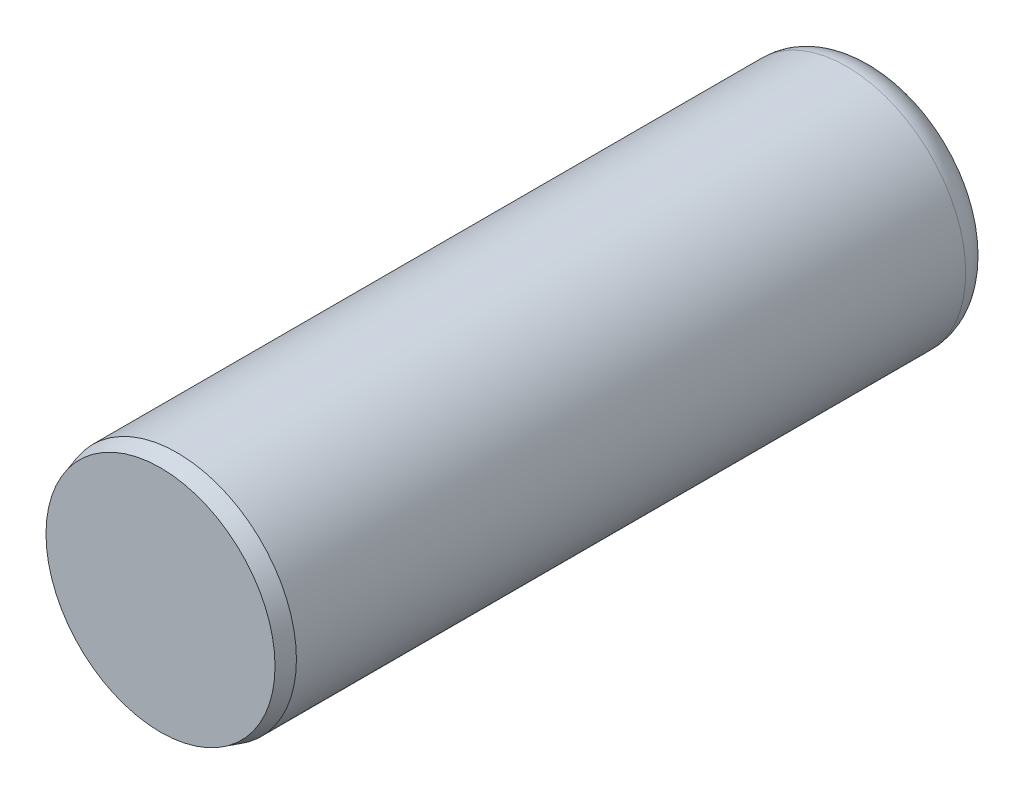
ISO-10303-21;
HEADER;
FILE_DESCRIPTION(('STEP AP214'),'2;1');
FILE_NAME('part.step','',(''),(''),'','','');
FILE_SCHEMA(('AUTOMOTIVE_DESIGN { 1 0 10303 214 1 1 1 1 }'));
ENDSEC;
DATA;
#1=APPLICATION_CONTEXT('core data for automotive mechanical design processes');
#2=APPLICATION_PROTOCOL_DEFINITION('international standard','automotive_design',2000,#1);
#3=PRODUCT_CONTEXT('',#1,'mechanical');
#4=PRODUCT('Part','Part','',(#3));
#5=PRODUCT_RELATED_PRODUCT_CATEGORY('part','',(#4));
#6=PRODUCT_DEFINITION_FORMATION('','',#4);
#7=PRODUCT_DEFINITION_CONTEXT('part definition',#1,'design');
#8=PRODUCT_DEFINITION('design','',#6,#7);
#9=PRODUCT_DEFINITION_SHAPE('','',#8);
#10=(LENGTH_UNIT() NAMED_UNIT(*) SI_UNIT(.MILLI.,.METRE.));
#11=(NAMED_UNIT(*) PLANE_ANGLE_UNIT() SI_UNIT($,.RADIAN.));
#12=(NAMED_UNIT(*) SI_UNIT($,.STERADIAN.) SOLID_ANGLE_UNIT());
#13=UNCERTAINTY_MEASURE_WITH_UNIT(LENGTH_MEASURE(1.E-05),#10,'distance_accuracy_value','');
#14=(GEOMETRIC_REPRESENTATION_CONTEXT(3) GLOBAL_UNCERTAINTY_ASSIGNED_CONTEXT((#13)) GLOBAL_UNIT_ASSIGNED_CONTEXT((#10,
#11,#12)) REPRESENTATION_CONTEXT('',''));
#15=CARTESIAN_POINT('',(0.,0.,0.));
#16=DIRECTION('',(0.,0.,1.));
#17=DIRECTION('',(1.,0.,0.));
#18=AXIS2_PLACEMENT_3D('',#15,#16,#17);
#19=CARTESIAN_POINT('',(0.,9.525,-38.1));
#20=DIRECTION('',(0.,0.,1.));
#21=DIRECTION('',(1.,0.,0.));
#22=AXIS2_PLACEMENT_3D('',#19,#20,#21);
#23=PLANE('',#22);
#24=CARTESIAN_POINT('',(0.,0.,-38.1));
#25=DIRECTION('',(0.,0.,1.));
#26=DIRECTION('',(1.,0.,0.));
#27=AXIS2_PLACEMENT_3D('',#24,#25,#26);
#28=CIRCLE('',#27,9.525);
#29=CARTESIAN_POINT('',(9.525,0.,-38.1));
#30=VERTEX_POINT('',#29);
#31=EDGE_CURVE('E10',#30,#30,#28,.T.);
#32=ORIENTED_EDGE('',*,*,#31,.F.);
#33=EDGE_LOOP('',(#32));
#34=FACE_BOUND('',#33,.T.);
#35=ADVANCED_FACE('F30',(#34),#23,.F.);
#36=CARTESIAN_POINT('',(0.,0.,-34.925));
#37=DIRECTION('',(0.,0.,1.));
#38=DIRECTION('',(1.,0.,0.));
#39=AXIS2_PLACEMENT_3D('',#36,#37,#38);
#40=TOROIDAL_SURFACE('',#39,9.525,3.175);
#41=CARTESIAN_POINT('',(0.,0.,-34.925));
#42=DIRECTION('',(0.,0.,1.));
#43=DIRECTION('',(1.,0.,0.));
#44=AXIS2_PLACEMENT_3D('',#41,#42,#43);
#45=CIRCLE('',#44,12.7);
#46=CARTESIAN_POINT('',(12.7,0.,-34.925));
#47=VERTEX_POINT('',#46);
#48=EDGE_CURVE('E36',#47,#47,#45,.T.);
#49=ORIENTED_EDGE('',*,*,#48,.F.);
#50=EDGE_LOOP('',(#49));
#51=FACE_BOUND('',#50,.T.);
#52=ORIENTED_EDGE('',*,*,#31,.T.);
#53=EDGE_LOOP('',(#52));
#54=FACE_BOUND('',#53,.T.);
#55=ADVANCED_FACE('F60',(#51,#54),#40,.T.);
#56=CARTESIAN_POINT('',(0.,0.,38.1));
#57=DIRECTION('',(0.,0.,1.));
#58=DIRECTION('',(1.,0.,0.));
#59=AXIS2_PLACEMENT_3D('',#56,#57,#58);
#60=CYLINDRICAL_SURFACE('',#59,12.7);
#61=CARTESIAN_POINT('',(0.,0.,36.3283934625288));
#62=DIRECTION('',(0.,0.,1.));
#63=DIRECTION('',(1.,0.,0.));
#64=AXIS2_PLACEMENT_3D('',#61,#62,#63);
#65=CIRCLE('',#64,12.7);
#66=CARTESIAN_POINT('',(12.7,0.,36.3283934625288));
#67=VERTEX_POINT('',#66);
#68=EDGE_CURVE('E40',#67,#67,#65,.T.);
#69=ORIENTED_EDGE('',*,*,#68,.F.);
#70=EDGE_LOOP('',(#69));
#71=FACE_BOUND('',#70,.T.);
#72=ORIENTED_EDGE('',*,*,#48,.T.);
#73=EDGE_LOOP('',(#72));
#74=FACE_BOUND('',#73,.T.);
#75=ADVANCED_FACE('F55',(#71,#74),#60,.T.);
#76=CARTESIAN_POINT('',(0.,0.,36.3283934625288));
#77=DIRECTION('',(0.,0.,-1.));
#78=DIRECTION('',(-1.,0.,0.));
#79=AXIS2_PLACEMENT_3D('',#76,#77,#78);
#80=CONICAL_SURFACE('',#79,12.7,0.279252680319094);
#81=CARTESIAN_POINT('',(0.,0.,38.1));
#82=DIRECTION('',(0.,0.,1.));
#83=DIRECTION('',(1.,0.,0.));
#84=AXIS2_PLACEMENT_3D('',#81,#82,#83);
#85=CIRCLE('',#84,12.192);
#86=CARTESIAN_POINT('',(12.192,0.,38.1));
#87=VERTEX_POINT('',#86);
#88=EDGE_CURVE('E44',#87,#87,#85,.T.);
#89=ORIENTED_EDGE('',*,*,#88,.F.);
#90=EDGE_LOOP('',(#89));
#91=FACE_BOUND('',#90,.T.);
#92=ORIENTED_EDGE('',*,*,#68,.T.);
#93=EDGE_LOOP('',(#92));
#94=FACE_BOUND('',#93,.T.);
#95=ADVANCED_FACE('F52',(#91,#94),#80,.T.);
#96=CARTESIAN_POINT('',(0.,0.,38.1));
#97=DIRECTION('',(0.,0.,-1.));
#98=DIRECTION('',(-1.,0.,0.));
#99=AXIS2_PLACEMENT_3D('',#96,#97,#98);
#100=PLANE('',#99);
#101=ORIENTED_EDGE('',*,*,#88,.T.);
#102=EDGE_LOOP('',(#101));
#103=FACE_BOUND('',#102,.T.);
#104=ADVANCED_FACE('F50',(#103),#100,.F.);
#105=CLOSED_SHELL('',(#35,#55,#75,#95,#104));
#106=MANIFOLD_SOLID_BREP('B2',#105);
#107=ADVANCED_BREP_SHAPE_REPRESENTATION('',(#18,#106),#14);
#108=SHAPE_DEFINITION_REPRESENTATION(#9,#107);
ENDSEC;
END-ISO-10303-21;
